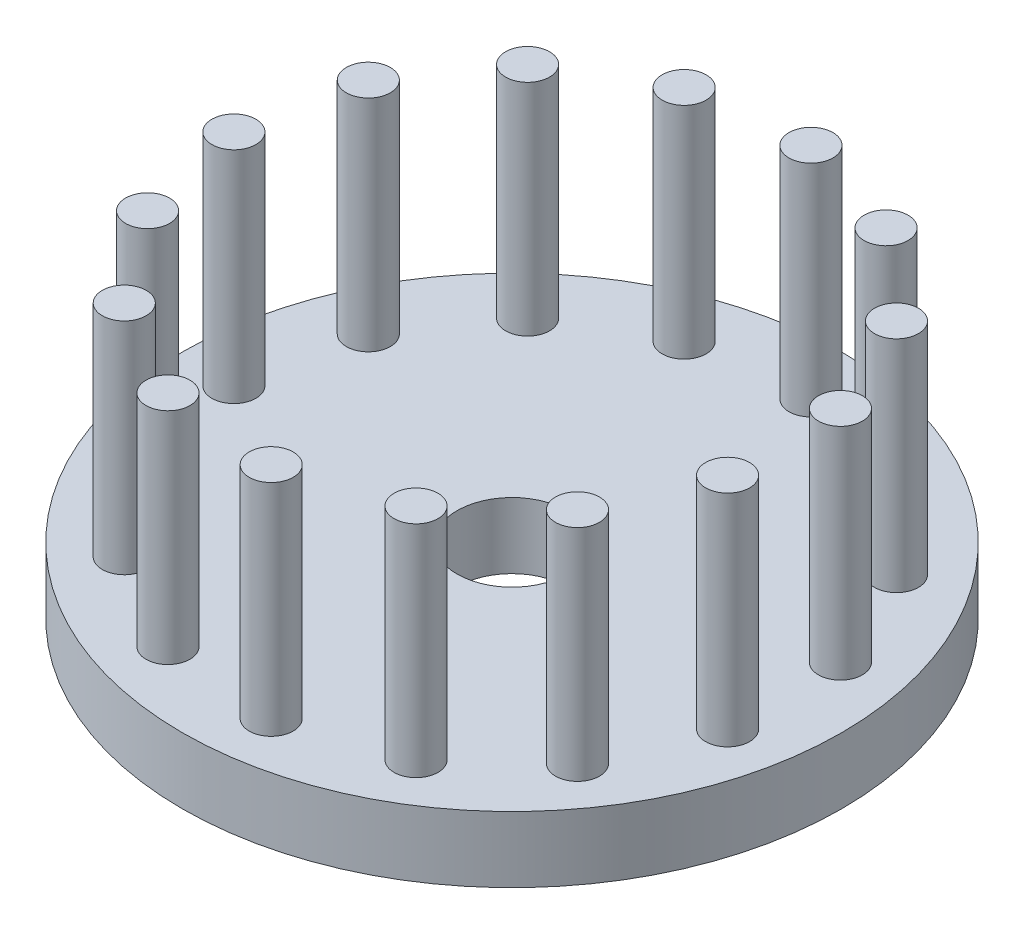
ISO-10303-21;
HEADER;
FILE_DESCRIPTION(('STEP AP214'),'2;1');
FILE_NAME('part.step','',(''),(''),'','','');
FILE_SCHEMA(('AUTOMOTIVE_DESIGN { 1 0 10303 214 1 1 1 1 }'));
ENDSEC;
DATA;
#1=APPLICATION_CONTEXT('core data for automotive mechanical design processes');
#2=APPLICATION_PROTOCOL_DEFINITION('international standard','automotive_design',2000,#1);
#3=PRODUCT_CONTEXT('',#1,'mechanical');
#4=PRODUCT('Part','Part','',(#3));
#5=PRODUCT_RELATED_PRODUCT_CATEGORY('part','',(#4));
#6=PRODUCT_DEFINITION_FORMATION('','',#4);
#7=PRODUCT_DEFINITION_CONTEXT('part definition',#1,'design');
#8=PRODUCT_DEFINITION('design','',#6,#7);
#9=PRODUCT_DEFINITION_SHAPE('','',#8);
#10=(LENGTH_UNIT() NAMED_UNIT(*) SI_UNIT(.MILLI.,.METRE.));
#11=(NAMED_UNIT(*) PLANE_ANGLE_UNIT() SI_UNIT($,.RADIAN.));
#12=(NAMED_UNIT(*) SI_UNIT($,.STERADIAN.) SOLID_ANGLE_UNIT());
#13=UNCERTAINTY_MEASURE_WITH_UNIT(LENGTH_MEASURE(1.E-05),#10,'distance_accuracy_value','');
#14=(GEOMETRIC_REPRESENTATION_CONTEXT(3) GLOBAL_UNCERTAINTY_ASSIGNED_CONTEXT((#13)) GLOBAL_UNIT_ASSIGNED_CONTEXT((#10,
#11,#12)) REPRESENTATION_CONTEXT('',''));
#15=CARTESIAN_POINT('',(0.,0.,0.));
#16=DIRECTION('',(0.,0.,1.));
#17=DIRECTION('',(1.,0.,0.));
#18=AXIS2_PLACEMENT_3D('',#15,#16,#17);
#19=CARTESIAN_POINT('',(0.,3.,0.));
#20=DIRECTION('',(0.,1.,0.));
#21=DIRECTION('',(0.,0.,1.));
#22=AXIS2_PLACEMENT_3D('',#19,#20,#21);
#23=PLANE('',#22);
#24=CARTESIAN_POINT('',(10.0218802409109,3.,-7.47073734224669));
#25=DIRECTION('',(0.,1.,0.));
#26=DIRECTION('',(-0.406736643075789,0.,0.913545457642606));
#27=AXIS2_PLACEMENT_3D('',#24,#25,#26);
#28=CIRCLE('',#27,1.);
#29=CARTESIAN_POINT('',(9.61514359783514,3.,-6.55719188460408));
#30=VERTEX_POINT('',#29);
#31=EDGE_CURVE('E133',#30,#30,#28,.T.);
#32=ORIENTED_EDGE('',*,*,#31,.F.);
#33=EDGE_LOOP('',(#32));
#34=FACE_BOUND('',#33,.T.);
#35=CARTESIAN_POINT('',(12.1940657990088,3.,-2.74859223775461));
#36=DIRECTION('',(0.,1.,0.));
#37=DIRECTION('',(-0.743144825477386,0.,0.669130606358867));
#38=AXIS2_PLACEMENT_3D('',#35,#36,#37);
#39=CIRCLE('',#38,1.);
#40=CARTESIAN_POINT('',(11.4509209735314,3.,-2.07946163139574));
#41=VERTEX_POINT('',#40);
#42=EDGE_CURVE('E127',#41,#41,#39,.T.);
#43=ORIENTED_EDGE('',*,*,#42,.F.);
#44=EDGE_LOOP('',(#43));
#45=FACE_BOUND('',#44,.T.);
#46=CARTESIAN_POINT('',(12.257786600848,3.,2.44880943482183));
#47=DIRECTION('',(0.,1.,0.));
#48=DIRECTION('',(-0.95105651629515,0.,0.309016994374957));
#49=AXIS2_PLACEMENT_3D('',#46,#47,#48);
#50=CIRCLE('',#49,1.);
#51=CARTESIAN_POINT('',(11.3067300845528,3.,2.75782642919679));
#52=VERTEX_POINT('',#51);
#53=EDGE_CURVE('E121',#52,#52,#50,.T.);
#54=ORIENTED_EDGE('',*,*,#53,.F.);
#55=EDGE_LOOP('',(#54));
#56=FACE_BOUND('',#55,.T.);
#57=CARTESIAN_POINT('',(10.2020247409052,3.,7.22278970938226));
#58=DIRECTION('',(0.,1.,0.));
#59=DIRECTION('',(-0.994521895368274,0.,-0.104528463267644));
#60=AXIS2_PLACEMENT_3D('',#57,#58,#59);
#61=CIRCLE('',#60,1.);
#62=CARTESIAN_POINT('',(9.20750284553693,3.,7.11826124611461));
#63=VERTEX_POINT('',#62);
#64=EDGE_CURVE('E115',#63,#63,#61,.T.);
#65=ORIENTED_EDGE('',*,*,#64,.F.);
#66=EDGE_LOOP('',(#65));
#67=FACE_BOUND('',#66,.T.);
#68=CARTESIAN_POINT('',(6.3822401207748,3.,10.7478840262059));
#69=DIRECTION('',(0.,1.,0.));
#70=DIRECTION('',(-0.866025403784443,0.,-0.499999999999992));
#71=AXIS2_PLACEMENT_3D('',#68,#69,#70);
#72=CIRCLE('',#71,1.);
#73=CARTESIAN_POINT('',(5.51621471699035,3.,10.2478840262059));
#74=VERTEX_POINT('',#73);
#75=EDGE_CURVE('E109',#74,#74,#72,.T.);
#76=ORIENTED_EDGE('',*,*,#75,.F.);
#77=EDGE_LOOP('',(#76));
#78=FACE_BOUND('',#77,.T.);
#79=CARTESIAN_POINT('',(1.45890820293115,3.,12.4145715534375));
#80=DIRECTION('',(0.,1.,0.));
#81=DIRECTION('',(-0.58778525229248,0.,-0.809016994374943));
#82=AXIS2_PLACEMENT_3D('',#79,#80,#81);
#83=CIRCLE('',#82,1.);
#84=CARTESIAN_POINT('',(0.871122950638671,3.,11.6055545590626));
#85=VERTEX_POINT('',#84);
#86=EDGE_CURVE('E103',#85,#85,#83,.T.);
#87=ORIENTED_EDGE('',*,*,#86,.F.);
#88=EDGE_LOOP('',(#87));
#89=FACE_BOUND('',#88,.T.);
#90=CARTESIAN_POINT('',(-3.71668219696423,3.,11.9346668762379));
#91=DIRECTION('',(0.,1.,0.));
#92=DIRECTION('',(-0.207911690817766,0.,-0.978147600733804));
#93=AXIS2_PLACEMENT_3D('',#90,#91,#92);
#94=CIRCLE('',#93,1.);
#95=CARTESIAN_POINT('',(-3.924593887782,3.,10.9565192755041));
#96=VERTEX_POINT('',#95);
#97=EDGE_CURVE('E97',#96,#96,#94,.T.);
#98=ORIENTED_EDGE('',*,*,#97,.F.);
#99=EDGE_LOOP('',(#98));
#100=FACE_BOUND('',#99,.T.);
#101=CARTESIAN_POINT('',(-8.24962448000674,3.,9.39114987309188));
#102=DIRECTION('',(0.,1.,0.));
#103=DIRECTION('',(0.207911690817753,0.,-0.978147600733807));
#104=AXIS2_PLACEMENT_3D('',#101,#102,#103);
#105=CIRCLE('',#104,1.);
#106=CARTESIAN_POINT('',(-8.04171278918899,3.,8.41300227235807));
#107=VERTEX_POINT('',#106);
#108=EDGE_CURVE('E91',#107,#107,#105,.T.);
#109=ORIENTED_EDGE('',*,*,#108,.F.);
#110=EDGE_LOOP('',(#109));
#111=FACE_BOUND('',#110,.T.);
#112=CARTESIAN_POINT('',(-11.3561317449705,3.,5.22381774097008));
#113=DIRECTION('',(0.,1.,0.));
#114=DIRECTION('',(0.587785252292469,0.,-0.80901699437495));
#115=AXIS2_PLACEMENT_3D('',#112,#113,#114);
#116=CIRCLE('',#115,1.);
#117=CARTESIAN_POINT('',(-10.768346492678,3.,4.41480074659512));
#118=VERTEX_POINT('',#117);
#119=EDGE_CURVE('E85',#118,#118,#116,.T.);
#120=ORIENTED_EDGE('',*,*,#119,.F.);
#121=EDGE_LOOP('',(#120));
#122=FACE_BOUND('',#121,.T.);
#123=CARTESIAN_POINT('',(-12.4990606640107,3.,0.153240064540216));
#124=DIRECTION('',(0.,1.,0.));
#125=DIRECTION('',(0.866025403784436,0.,-0.500000000000004));
#126=AXIS2_PLACEMENT_3D('',#123,#124,#125);
#127=CIRCLE('',#126,1.);
#128=CARTESIAN_POINT('',(-11.6330352602263,3.,-0.346759935459788));
#129=VERTEX_POINT('',#128);
#130=EDGE_CURVE('E79',#129,#129,#127,.T.);
#131=ORIENTED_EDGE('',*,*,#130,.F.);
#132=EDGE_LOOP('',(#131));
#133=FACE_BOUND('',#132,.T.);
#134=CARTESIAN_POINT('',(-11.4807884438421,3.,-4.94383421119094));
#135=DIRECTION('',(0.,1.,0.));
#136=DIRECTION('',(0.994521895368273,0.,-0.104528463267657));
#137=AXIS2_PLACEMENT_3D('',#134,#135,#136);
#138=CIRCLE('',#137,1.);
#139=CARTESIAN_POINT('',(-10.4862665484738,3.,-5.04836267445859));
#140=VERTEX_POINT('',#139);
#141=EDGE_CURVE('E73',#140,#140,#138,.T.);
#142=ORIENTED_EDGE('',*,*,#141,.F.);
#143=EDGE_LOOP('',(#142));
#144=FACE_BOUND('',#143,.T.);
#145=CARTESIAN_POINT('',(-8.4773836020445,3.,-9.18607463848335));
#146=DIRECTION('',(0.,1.,0.));
#147=DIRECTION('',(0.951056516295154,0.,0.309016994374945));
#148=AXIS2_PLACEMENT_3D('',#145,#146,#147);
#149=CIRCLE('',#148,1.);
#150=CARTESIAN_POINT('',(-7.52632708574935,3.,-8.87705764410841));
#151=VERTEX_POINT('',#150);
#152=EDGE_CURVE('E67',#151,#151,#149,.T.);
#153=ORIENTED_EDGE('',*,*,#152,.F.);
#154=EDGE_LOOP('',(#153));
#155=FACE_BOUND('',#154,.T.);
#156=CARTESIAN_POINT('',(-4.00816212084115,3.,-11.8399593079138));
#157=DIRECTION('',(0.,1.,0.));
#158=DIRECTION('',(0.743144825477395,0.,0.669130606358857));
#159=AXIS2_PLACEMENT_3D('',#156,#157,#158);
#160=CIRCLE('',#159,1.);
#161=CARTESIAN_POINT('',(-3.26501729536376,3.,-11.1708287015549));
#162=VERTEX_POINT('',#161);
#163=EDGE_CURVE('E61',#162,#162,#160,.T.);
#164=ORIENTED_EDGE('',*,*,#163,.F.);
#165=EDGE_LOOP('',(#164));
#166=FACE_BOUND('',#165,.T.);
#167=CARTESIAN_POINT('',(1.15410700406537,3.,-12.4466074503524));
#168=DIRECTION('',(0.,1.,0.));
#169=DIRECTION('',(0.406736643075801,0.,0.913545457642601));
#170=AXIS2_PLACEMENT_3D('',#167,#168,#169);
#171=CIRCLE('',#170,1.);
#172=CARTESIAN_POINT('',(1.56084364714117,3.,-11.5330619927098));
#173=VERTEX_POINT('',#172);
#174=EDGE_CURVE('E55',#173,#173,#171,.T.);
#175=ORIENTED_EDGE('',*,*,#174,.F.);
#176=EDGE_LOOP('',(#175));
#177=FACE_BOUND('',#176,.T.);
#178=CARTESIAN_POINT('',(6.11682054323601,3.,-10.9011240907461));
#179=DIRECTION('',(0.,1.,0.));
#180=DIRECTION('',(0.,0.,1.));
#181=AXIS2_PLACEMENT_3D('',#178,#179,#180);
#182=CIRCLE('',#181,1.);
#183=CARTESIAN_POINT('',(6.11682054323601,3.,-9.90112409074614));
#184=VERTEX_POINT('',#183);
#185=EDGE_CURVE('E49',#184,#184,#182,.T.);
#186=ORIENTED_EDGE('',*,*,#185,.F.);
#187=EDGE_LOOP('',(#186));
#188=FACE_BOUND('',#187,.T.);
#189=CARTESIAN_POINT('',(0.,3.,0.));
#190=DIRECTION('',(0.,1.,0.));
#191=DIRECTION('',(0.,0.,1.));
#192=AXIS2_PLACEMENT_3D('',#189,#190,#191);
#193=CIRCLE('',#192,15.);
#194=CARTESIAN_POINT('',(0.,3.,15.));
#195=VERTEX_POINT('',#194);
#196=EDGE_CURVE('E10',#195,#195,#193,.T.);
#197=ORIENTED_EDGE('',*,*,#196,.T.);
#198=EDGE_LOOP('',(#197));
#199=FACE_BOUND('',#198,.T.);
#200=CARTESIAN_POINT('',(0.,3.,0.));
#201=DIRECTION('',(0.,1.,0.));
#202=DIRECTION('',(0.,0.,1.));
#203=AXIS2_PLACEMENT_3D('',#200,#201,#202);
#204=CIRCLE('',#203,2.5);
#205=CARTESIAN_POINT('',(0.,3.,2.5));
#206=VERTEX_POINT('',#205);
#207=EDGE_CURVE('E41',#206,#206,#204,.T.);
#208=ORIENTED_EDGE('',*,*,#207,.F.);
#209=EDGE_LOOP('',(#208));
#210=FACE_BOUND('',#209,.T.);
#211=ADVANCED_FACE('F30',(#34,#45,#56,#67,#78,#89,#100,#111,#122,#133,#144,#155,#166,#177,#188,
#199,#210),#23,.T.);
#212=CARTESIAN_POINT('',(0.,0.,0.));
#213=DIRECTION('',(0.,1.,0.));
#214=DIRECTION('',(0.,0.,1.));
#215=AXIS2_PLACEMENT_3D('',#212,#213,#214);
#216=PLANE('',#215);
#217=CARTESIAN_POINT('',(0.,0.,0.));
#218=DIRECTION('',(0.,1.,0.));
#219=DIRECTION('',(0.,0.,1.));
#220=AXIS2_PLACEMENT_3D('',#217,#218,#219);
#221=CIRCLE('',#220,15.);
#222=CARTESIAN_POINT('',(0.,0.,15.));
#223=VERTEX_POINT('',#222);
#224=EDGE_CURVE('E34',#223,#223,#221,.T.);
#225=ORIENTED_EDGE('',*,*,#224,.F.);
#226=EDGE_LOOP('',(#225));
#227=FACE_BOUND('',#226,.T.);
#228=CARTESIAN_POINT('',(0.,0.,0.));
#229=DIRECTION('',(0.,1.,0.));
#230=DIRECTION('',(0.,0.,1.));
#231=AXIS2_PLACEMENT_3D('',#228,#229,#230);
#232=CIRCLE('',#231,2.5);
#233=CARTESIAN_POINT('',(0.,0.,2.5));
#234=VERTEX_POINT('',#233);
#235=EDGE_CURVE('E43',#234,#234,#232,.T.);
#236=ORIENTED_EDGE('',*,*,#235,.T.);
#237=EDGE_LOOP('',(#236));
#238=FACE_BOUND('',#237,.T.);
#239=ADVANCED_FACE('F150',(#227,#238),#216,.F.);
#240=CARTESIAN_POINT('',(0.,3.,0.));
#241=DIRECTION('',(0.,-1.,0.));
#242=DIRECTION('',(0.,0.,-1.));
#243=AXIS2_PLACEMENT_3D('',#240,#241,#242);
#244=CYLINDRICAL_SURFACE('',#243,15.);
#245=ORIENTED_EDGE('',*,*,#196,.F.);
#246=EDGE_LOOP('',(#245));
#247=FACE_BOUND('',#246,.T.);
#248=ORIENTED_EDGE('',*,*,#224,.T.);
#249=EDGE_LOOP('',(#248));
#250=FACE_BOUND('',#249,.T.);
#251=ADVANCED_FACE('F32',(#247,#250),#244,.T.);
#252=CARTESIAN_POINT('',(0.,3.,0.));
#253=DIRECTION('',(0.,-1.,0.));
#254=DIRECTION('',(0.,0.,-1.));
#255=AXIS2_PLACEMENT_3D('',#252,#253,#254);
#256=CYLINDRICAL_SURFACE('',#255,2.5);
#257=ORIENTED_EDGE('',*,*,#207,.T.);
#258=EDGE_LOOP('',(#257));
#259=FACE_BOUND('',#258,.T.);
#260=ORIENTED_EDGE('',*,*,#235,.F.);
#261=EDGE_LOOP('',(#260));
#262=FACE_BOUND('',#261,.T.);
#263=ADVANCED_FACE('F182',(#259,#262),#256,.F.);
#264=CARTESIAN_POINT('',(6.11682054323601,13.,-10.9011240907461));
#265=DIRECTION('',(0.,-1.,0.));
#266=DIRECTION('',(0.,0.,-1.));
#267=AXIS2_PLACEMENT_3D('',#264,#265,#266);
#268=CYLINDRICAL_SURFACE('',#267,1.);
#269=CARTESIAN_POINT('',(6.11682054323601,13.,-10.9011240907461));
#270=DIRECTION('',(0.,1.,0.));
#271=DIRECTION('',(0.,0.,1.));
#272=AXIS2_PLACEMENT_3D('',#269,#270,#271);
#273=CIRCLE('',#272,1.);
#274=CARTESIAN_POINT('',(6.11682054323601,13.,-9.90112409074614));
#275=VERTEX_POINT('',#274);
#276=EDGE_CURVE('E46',#275,#275,#273,.T.);
#277=ORIENTED_EDGE('',*,*,#276,.F.);
#278=EDGE_LOOP('',(#277));
#279=FACE_BOUND('',#278,.T.);
#280=ORIENTED_EDGE('',*,*,#185,.T.);
#281=EDGE_LOOP('',(#280));
#282=FACE_BOUND('',#281,.T.);
#283=ADVANCED_FACE('F185',(#279,#282),#268,.T.);
#284=CARTESIAN_POINT('',(6.11682054323601,13.,-10.9011240907461));
#285=DIRECTION('',(0.,1.,0.));
#286=DIRECTION('',(0.,0.,1.));
#287=AXIS2_PLACEMENT_3D('',#284,#285,#286);
#288=PLANE('',#287);
#289=ORIENTED_EDGE('',*,*,#276,.T.);
#290=EDGE_LOOP('',(#289));
#291=FACE_BOUND('',#290,.T.);
#292=ADVANCED_FACE('F199',(#291),#288,.T.);
#293=CARTESIAN_POINT('',(1.15410700406537,13.,-12.4466074503524));
#294=DIRECTION('',(0.,-1.,0.));
#295=DIRECTION('',(0.,0.,-1.));
#296=AXIS2_PLACEMENT_3D('',#293,#294,#295);
#297=CYLINDRICAL_SURFACE('',#296,1.);
#298=CARTESIAN_POINT('',(1.15410700406537,13.,-12.4466074503524));
#299=DIRECTION('',(0.,1.,0.));
#300=DIRECTION('',(0.406736643075801,0.,0.913545457642601));
#301=AXIS2_PLACEMENT_3D('',#298,#299,#300);
#302=CIRCLE('',#301,1.);
#303=CARTESIAN_POINT('',(1.56084364714117,13.,-11.5330619927098));
#304=VERTEX_POINT('',#303);
#305=EDGE_CURVE('E52',#304,#304,#302,.T.);
#306=ORIENTED_EDGE('',*,*,#305,.F.);
#307=EDGE_LOOP('',(#306));
#308=FACE_BOUND('',#307,.T.);
#309=ORIENTED_EDGE('',*,*,#174,.T.);
#310=EDGE_LOOP('',(#309));
#311=FACE_BOUND('',#310,.T.);
#312=ADVANCED_FACE('F203',(#308,#311),#297,.T.);
#313=CARTESIAN_POINT('',(1.15410700406537,13.,-12.4466074503524));
#314=DIRECTION('',(0.,1.,0.));
#315=DIRECTION('',(0.406736643075801,0.,0.913545457642601));
#316=AXIS2_PLACEMENT_3D('',#313,#314,#315);
#317=PLANE('',#316);
#318=ORIENTED_EDGE('',*,*,#305,.T.);
#319=EDGE_LOOP('',(#318));
#320=FACE_BOUND('',#319,.T.);
#321=ADVANCED_FACE('F207',(#320),#317,.T.);
#322=CARTESIAN_POINT('',(-4.00816212084115,13.,-11.8399593079138));
#323=DIRECTION('',(0.,-1.,0.));
#324=DIRECTION('',(0.,0.,-1.));
#325=AXIS2_PLACEMENT_3D('',#322,#323,#324);
#326=CYLINDRICAL_SURFACE('',#325,1.);
#327=CARTESIAN_POINT('',(-4.00816212084115,13.,-11.8399593079138));
#328=DIRECTION('',(0.,1.,0.));
#329=DIRECTION('',(0.743144825477395,0.,0.669130606358857));
#330=AXIS2_PLACEMENT_3D('',#327,#328,#329);
#331=CIRCLE('',#330,1.);
#332=CARTESIAN_POINT('',(-3.26501729536376,13.,-11.1708287015549));
#333=VERTEX_POINT('',#332);
#334=EDGE_CURVE('E58',#333,#333,#331,.T.);
#335=ORIENTED_EDGE('',*,*,#334,.F.);
#336=EDGE_LOOP('',(#335));
#337=FACE_BOUND('',#336,.T.);
#338=ORIENTED_EDGE('',*,*,#163,.T.);
#339=EDGE_LOOP('',(#338));
#340=FACE_BOUND('',#339,.T.);
#341=ADVANCED_FACE('F211',(#337,#340),#326,.T.);
#342=CARTESIAN_POINT('',(-4.00816212084115,13.,-11.8399593079138));
#343=DIRECTION('',(0.,1.,0.));
#344=DIRECTION('',(0.743144825477395,0.,0.669130606358857));
#345=AXIS2_PLACEMENT_3D('',#342,#343,#344);
#346=PLANE('',#345);
#347=ORIENTED_EDGE('',*,*,#334,.T.);
#348=EDGE_LOOP('',(#347));
#349=FACE_BOUND('',#348,.T.);
#350=ADVANCED_FACE('F215',(#349),#346,.T.);
#351=CARTESIAN_POINT('',(-8.4773836020445,13.,-9.18607463848335));
#352=DIRECTION('',(0.,-1.,0.));
#353=DIRECTION('',(0.,0.,-1.));
#354=AXIS2_PLACEMENT_3D('',#351,#352,#353);
#355=CYLINDRICAL_SURFACE('',#354,1.);
#356=CARTESIAN_POINT('',(-8.4773836020445,13.,-9.18607463848335));
#357=DIRECTION('',(0.,1.,0.));
#358=DIRECTION('',(0.951056516295154,0.,0.309016994374945));
#359=AXIS2_PLACEMENT_3D('',#356,#357,#358);
#360=CIRCLE('',#359,1.);
#361=CARTESIAN_POINT('',(-7.52632708574935,13.,-8.87705764410841));
#362=VERTEX_POINT('',#361);
#363=EDGE_CURVE('E64',#362,#362,#360,.T.);
#364=ORIENTED_EDGE('',*,*,#363,.F.);
#365=EDGE_LOOP('',(#364));
#366=FACE_BOUND('',#365,.T.);
#367=ORIENTED_EDGE('',*,*,#152,.T.);
#368=EDGE_LOOP('',(#367));
#369=FACE_BOUND('',#368,.T.);
#370=ADVANCED_FACE('F219',(#366,#369),#355,.T.);
#371=CARTESIAN_POINT('',(-8.4773836020445,13.,-9.18607463848335));
#372=DIRECTION('',(0.,1.,0.));
#373=DIRECTION('',(0.951056516295154,0.,0.309016994374945));
#374=AXIS2_PLACEMENT_3D('',#371,#372,#373);
#375=PLANE('',#374);
#376=ORIENTED_EDGE('',*,*,#363,.T.);
#377=EDGE_LOOP('',(#376));
#378=FACE_BOUND('',#377,.T.);
#379=ADVANCED_FACE('F223',(#378),#375,.T.);
#380=CARTESIAN_POINT('',(-11.4807884438421,13.,-4.94383421119094));
#381=DIRECTION('',(0.,-1.,0.));
#382=DIRECTION('',(0.,0.,-1.));
#383=AXIS2_PLACEMENT_3D('',#380,#381,#382);
#384=CYLINDRICAL_SURFACE('',#383,1.);
#385=CARTESIAN_POINT('',(-11.4807884438421,13.,-4.94383421119094));
#386=DIRECTION('',(0.,1.,0.));
#387=DIRECTION('',(0.994521895368273,0.,-0.104528463267657));
#388=AXIS2_PLACEMENT_3D('',#385,#386,#387);
#389=CIRCLE('',#388,1.);
#390=CARTESIAN_POINT('',(-10.4862665484738,13.,-5.04836267445859));
#391=VERTEX_POINT('',#390);
#392=EDGE_CURVE('E70',#391,#391,#389,.T.);
#393=ORIENTED_EDGE('',*,*,#392,.F.);
#394=EDGE_LOOP('',(#393));
#395=FACE_BOUND('',#394,.T.);
#396=ORIENTED_EDGE('',*,*,#141,.T.);
#397=EDGE_LOOP('',(#396));
#398=FACE_BOUND('',#397,.T.);
#399=ADVANCED_FACE('F227',(#395,#398),#384,.T.);
#400=CARTESIAN_POINT('',(-11.4807884438421,13.,-4.94383421119094));
#401=DIRECTION('',(0.,1.,0.));
#402=DIRECTION('',(0.994521895368273,0.,-0.104528463267657));
#403=AXIS2_PLACEMENT_3D('',#400,#401,#402);
#404=PLANE('',#403);
#405=ORIENTED_EDGE('',*,*,#392,.T.);
#406=EDGE_LOOP('',(#405));
#407=FACE_BOUND('',#406,.T.);
#408=ADVANCED_FACE('F231',(#407),#404,.T.);
#409=CARTESIAN_POINT('',(-12.4990606640107,13.,0.153240064540216));
#410=DIRECTION('',(0.,-1.,0.));
#411=DIRECTION('',(0.,0.,-1.));
#412=AXIS2_PLACEMENT_3D('',#409,#410,#411);
#413=CYLINDRICAL_SURFACE('',#412,1.);
#414=CARTESIAN_POINT('',(-12.4990606640107,13.,0.153240064540216));
#415=DIRECTION('',(0.,1.,0.));
#416=DIRECTION('',(0.866025403784436,0.,-0.500000000000004));
#417=AXIS2_PLACEMENT_3D('',#414,#415,#416);
#418=CIRCLE('',#417,1.);
#419=CARTESIAN_POINT('',(-11.6330352602263,13.,-0.346759935459788));
#420=VERTEX_POINT('',#419);
#421=EDGE_CURVE('E76',#420,#420,#418,.T.);
#422=ORIENTED_EDGE('',*,*,#421,.F.);
#423=EDGE_LOOP('',(#422));
#424=FACE_BOUND('',#423,.T.);
#425=ORIENTED_EDGE('',*,*,#130,.T.);
#426=EDGE_LOOP('',(#425));
#427=FACE_BOUND('',#426,.T.);
#428=ADVANCED_FACE('F235',(#424,#427),#413,.T.);
#429=CARTESIAN_POINT('',(-12.4990606640107,13.,0.153240064540216));
#430=DIRECTION('',(0.,1.,0.));
#431=DIRECTION('',(0.866025403784436,0.,-0.500000000000004));
#432=AXIS2_PLACEMENT_3D('',#429,#430,#431);
#433=PLANE('',#432);
#434=ORIENTED_EDGE('',*,*,#421,.T.);
#435=EDGE_LOOP('',(#434));
#436=FACE_BOUND('',#435,.T.);
#437=ADVANCED_FACE('F239',(#436),#433,.T.);
#438=CARTESIAN_POINT('',(-11.3561317449705,13.,5.22381774097008));
#439=DIRECTION('',(0.,-1.,0.));
#440=DIRECTION('',(0.,0.,-1.));
#441=AXIS2_PLACEMENT_3D('',#438,#439,#440);
#442=CYLINDRICAL_SURFACE('',#441,1.);
#443=CARTESIAN_POINT('',(-11.3561317449705,13.,5.22381774097008));
#444=DIRECTION('',(0.,1.,0.));
#445=DIRECTION('',(0.587785252292469,0.,-0.80901699437495));
#446=AXIS2_PLACEMENT_3D('',#443,#444,#445);
#447=CIRCLE('',#446,1.);
#448=CARTESIAN_POINT('',(-10.768346492678,13.,4.41480074659512));
#449=VERTEX_POINT('',#448);
#450=EDGE_CURVE('E82',#449,#449,#447,.T.);
#451=ORIENTED_EDGE('',*,*,#450,.F.);
#452=EDGE_LOOP('',(#451));
#453=FACE_BOUND('',#452,.T.);
#454=ORIENTED_EDGE('',*,*,#119,.T.);
#455=EDGE_LOOP('',(#454));
#456=FACE_BOUND('',#455,.T.);
#457=ADVANCED_FACE('F243',(#453,#456),#442,.T.);
#458=CARTESIAN_POINT('',(-11.3561317449705,13.,5.22381774097008));
#459=DIRECTION('',(0.,1.,0.));
#460=DIRECTION('',(0.587785252292469,0.,-0.80901699437495));
#461=AXIS2_PLACEMENT_3D('',#458,#459,#460);
#462=PLANE('',#461);
#463=ORIENTED_EDGE('',*,*,#450,.T.);
#464=EDGE_LOOP('',(#463));
#465=FACE_BOUND('',#464,.T.);
#466=ADVANCED_FACE('F247',(#465),#462,.T.);
#467=CARTESIAN_POINT('',(-8.24962448000674,13.,9.39114987309188));
#468=DIRECTION('',(0.,-1.,0.));
#469=DIRECTION('',(0.,0.,-1.));
#470=AXIS2_PLACEMENT_3D('',#467,#468,#469);
#471=CYLINDRICAL_SURFACE('',#470,1.);
#472=CARTESIAN_POINT('',(-8.24962448000674,13.,9.39114987309188));
#473=DIRECTION('',(0.,1.,0.));
#474=DIRECTION('',(0.207911690817753,0.,-0.978147600733807));
#475=AXIS2_PLACEMENT_3D('',#472,#473,#474);
#476=CIRCLE('',#475,1.);
#477=CARTESIAN_POINT('',(-8.04171278918899,13.,8.41300227235807));
#478=VERTEX_POINT('',#477);
#479=EDGE_CURVE('E88',#478,#478,#476,.T.);
#480=ORIENTED_EDGE('',*,*,#479,.F.);
#481=EDGE_LOOP('',(#480));
#482=FACE_BOUND('',#481,.T.);
#483=ORIENTED_EDGE('',*,*,#108,.T.);
#484=EDGE_LOOP('',(#483));
#485=FACE_BOUND('',#484,.T.);
#486=ADVANCED_FACE('F251',(#482,#485),#471,.T.);
#487=CARTESIAN_POINT('',(-8.24962448000674,13.,9.39114987309188));
#488=DIRECTION('',(0.,1.,0.));
#489=DIRECTION('',(0.207911690817753,0.,-0.978147600733807));
#490=AXIS2_PLACEMENT_3D('',#487,#488,#489);
#491=PLANE('',#490);
#492=ORIENTED_EDGE('',*,*,#479,.T.);
#493=EDGE_LOOP('',(#492));
#494=FACE_BOUND('',#493,.T.);
#495=ADVANCED_FACE('F255',(#494),#491,.T.);
#496=CARTESIAN_POINT('',(-3.71668219696423,13.,11.9346668762379));
#497=DIRECTION('',(0.,-1.,0.));
#498=DIRECTION('',(0.,0.,-1.));
#499=AXIS2_PLACEMENT_3D('',#496,#497,#498);
#500=CYLINDRICAL_SURFACE('',#499,1.);
#501=CARTESIAN_POINT('',(-3.71668219696423,13.,11.9346668762379));
#502=DIRECTION('',(0.,1.,0.));
#503=DIRECTION('',(-0.207911690817766,0.,-0.978147600733804));
#504=AXIS2_PLACEMENT_3D('',#501,#502,#503);
#505=CIRCLE('',#504,1.);
#506=CARTESIAN_POINT('',(-3.924593887782,13.,10.9565192755041));
#507=VERTEX_POINT('',#506);
#508=EDGE_CURVE('E94',#507,#507,#505,.T.);
#509=ORIENTED_EDGE('',*,*,#508,.F.);
#510=EDGE_LOOP('',(#509));
#511=FACE_BOUND('',#510,.T.);
#512=ORIENTED_EDGE('',*,*,#97,.T.);
#513=EDGE_LOOP('',(#512));
#514=FACE_BOUND('',#513,.T.);
#515=ADVANCED_FACE('F259',(#511,#514),#500,.T.);
#516=CARTESIAN_POINT('',(-3.71668219696423,13.,11.9346668762379));
#517=DIRECTION('',(0.,1.,0.));
#518=DIRECTION('',(-0.207911690817766,0.,-0.978147600733804));
#519=AXIS2_PLACEMENT_3D('',#516,#517,#518);
#520=PLANE('',#519);
#521=ORIENTED_EDGE('',*,*,#508,.T.);
#522=EDGE_LOOP('',(#521));
#523=FACE_BOUND('',#522,.T.);
#524=ADVANCED_FACE('F263',(#523),#520,.T.);
#525=CARTESIAN_POINT('',(1.45890820293115,13.,12.4145715534375));
#526=DIRECTION('',(0.,-1.,0.));
#527=DIRECTION('',(0.,0.,-1.));
#528=AXIS2_PLACEMENT_3D('',#525,#526,#527);
#529=CYLINDRICAL_SURFACE('',#528,1.);
#530=CARTESIAN_POINT('',(1.45890820293115,13.,12.4145715534375));
#531=DIRECTION('',(0.,1.,0.));
#532=DIRECTION('',(-0.58778525229248,0.,-0.809016994374943));
#533=AXIS2_PLACEMENT_3D('',#530,#531,#532);
#534=CIRCLE('',#533,1.);
#535=CARTESIAN_POINT('',(0.871122950638671,13.,11.6055545590626));
#536=VERTEX_POINT('',#535);
#537=EDGE_CURVE('E100',#536,#536,#534,.T.);
#538=ORIENTED_EDGE('',*,*,#537,.F.);
#539=EDGE_LOOP('',(#538));
#540=FACE_BOUND('',#539,.T.);
#541=ORIENTED_EDGE('',*,*,#86,.T.);
#542=EDGE_LOOP('',(#541));
#543=FACE_BOUND('',#542,.T.);
#544=ADVANCED_FACE('F267',(#540,#543),#529,.T.);
#545=CARTESIAN_POINT('',(1.45890820293115,13.,12.4145715534375));
#546=DIRECTION('',(0.,1.,0.));
#547=DIRECTION('',(-0.58778525229248,0.,-0.809016994374943));
#548=AXIS2_PLACEMENT_3D('',#545,#546,#547);
#549=PLANE('',#548);
#550=ORIENTED_EDGE('',*,*,#537,.T.);
#551=EDGE_LOOP('',(#550));
#552=FACE_BOUND('',#551,.T.);
#553=ADVANCED_FACE('F271',(#552),#549,.T.);
#554=CARTESIAN_POINT('',(6.3822401207748,13.,10.7478840262059));
#555=DIRECTION('',(0.,-1.,0.));
#556=DIRECTION('',(0.,0.,-1.));
#557=AXIS2_PLACEMENT_3D('',#554,#555,#556);
#558=CYLINDRICAL_SURFACE('',#557,1.);
#559=CARTESIAN_POINT('',(6.3822401207748,13.,10.7478840262059));
#560=DIRECTION('',(0.,1.,0.));
#561=DIRECTION('',(-0.866025403784443,0.,-0.499999999999992));
#562=AXIS2_PLACEMENT_3D('',#559,#560,#561);
#563=CIRCLE('',#562,1.);
#564=CARTESIAN_POINT('',(5.51621471699035,13.,10.2478840262059));
#565=VERTEX_POINT('',#564);
#566=EDGE_CURVE('E106',#565,#565,#563,.T.);
#567=ORIENTED_EDGE('',*,*,#566,.F.);
#568=EDGE_LOOP('',(#567));
#569=FACE_BOUND('',#568,.T.);
#570=ORIENTED_EDGE('',*,*,#75,.T.);
#571=EDGE_LOOP('',(#570));
#572=FACE_BOUND('',#571,.T.);
#573=ADVANCED_FACE('F275',(#569,#572),#558,.T.);
#574=CARTESIAN_POINT('',(6.3822401207748,13.,10.7478840262059));
#575=DIRECTION('',(0.,1.,0.));
#576=DIRECTION('',(-0.866025403784443,0.,-0.499999999999992));
#577=AXIS2_PLACEMENT_3D('',#574,#575,#576);
#578=PLANE('',#577);
#579=ORIENTED_EDGE('',*,*,#566,.T.);
#580=EDGE_LOOP('',(#579));
#581=FACE_BOUND('',#580,.T.);
#582=ADVANCED_FACE('F279',(#581),#578,.T.);
#583=CARTESIAN_POINT('',(10.2020247409052,13.,7.22278970938226));
#584=DIRECTION('',(0.,-1.,0.));
#585=DIRECTION('',(0.,0.,-1.));
#586=AXIS2_PLACEMENT_3D('',#583,#584,#585);
#587=CYLINDRICAL_SURFACE('',#586,1.);
#588=CARTESIAN_POINT('',(10.2020247409052,13.,7.22278970938226));
#589=DIRECTION('',(0.,1.,0.));
#590=DIRECTION('',(-0.994521895368274,0.,-0.104528463267644));
#591=AXIS2_PLACEMENT_3D('',#588,#589,#590);
#592=CIRCLE('',#591,1.);
#593=CARTESIAN_POINT('',(9.20750284553693,13.,7.11826124611461));
#594=VERTEX_POINT('',#593);
#595=EDGE_CURVE('E112',#594,#594,#592,.T.);
#596=ORIENTED_EDGE('',*,*,#595,.F.);
#597=EDGE_LOOP('',(#596));
#598=FACE_BOUND('',#597,.T.);
#599=ORIENTED_EDGE('',*,*,#64,.T.);
#600=EDGE_LOOP('',(#599));
#601=FACE_BOUND('',#600,.T.);
#602=ADVANCED_FACE('F283',(#598,#601),#587,.T.);
#603=CARTESIAN_POINT('',(10.2020247409052,13.,7.22278970938226));
#604=DIRECTION('',(0.,1.,0.));
#605=DIRECTION('',(-0.994521895368274,0.,-0.104528463267644));
#606=AXIS2_PLACEMENT_3D('',#603,#604,#605);
#607=PLANE('',#606);
#608=ORIENTED_EDGE('',*,*,#595,.T.);
#609=EDGE_LOOP('',(#608));
#610=FACE_BOUND('',#609,.T.);
#611=ADVANCED_FACE('F287',(#610),#607,.T.);
#612=CARTESIAN_POINT('',(12.257786600848,13.,2.44880943482183));
#613=DIRECTION('',(0.,-1.,0.));
#614=DIRECTION('',(0.,0.,-1.));
#615=AXIS2_PLACEMENT_3D('',#612,#613,#614);
#616=CYLINDRICAL_SURFACE('',#615,1.);
#617=CARTESIAN_POINT('',(12.257786600848,13.,2.44880943482183));
#618=DIRECTION('',(0.,1.,0.));
#619=DIRECTION('',(-0.95105651629515,0.,0.309016994374957));
#620=AXIS2_PLACEMENT_3D('',#617,#618,#619);
#621=CIRCLE('',#620,1.);
#622=CARTESIAN_POINT('',(11.3067300845528,13.,2.75782642919679));
#623=VERTEX_POINT('',#622);
#624=EDGE_CURVE('E118',#623,#623,#621,.T.);
#625=ORIENTED_EDGE('',*,*,#624,.F.);
#626=EDGE_LOOP('',(#625));
#627=FACE_BOUND('',#626,.T.);
#628=ORIENTED_EDGE('',*,*,#53,.T.);
#629=EDGE_LOOP('',(#628));
#630=FACE_BOUND('',#629,.T.);
#631=ADVANCED_FACE('F291',(#627,#630),#616,.T.);
#632=CARTESIAN_POINT('',(12.257786600848,13.,2.44880943482183));
#633=DIRECTION('',(0.,1.,0.));
#634=DIRECTION('',(-0.95105651629515,0.,0.309016994374957));
#635=AXIS2_PLACEMENT_3D('',#632,#633,#634);
#636=PLANE('',#635);
#637=ORIENTED_EDGE('',*,*,#624,.T.);
#638=EDGE_LOOP('',(#637));
#639=FACE_BOUND('',#638,.T.);
#640=ADVANCED_FACE('F295',(#639),#636,.T.);
#641=CARTESIAN_POINT('',(12.1940657990088,13.,-2.74859223775461));
#642=DIRECTION('',(0.,-1.,0.));
#643=DIRECTION('',(0.,0.,-1.));
#644=AXIS2_PLACEMENT_3D('',#641,#642,#643);
#645=CYLINDRICAL_SURFACE('',#644,1.);
#646=CARTESIAN_POINT('',(12.1940657990088,13.,-2.74859223775461));
#647=DIRECTION('',(0.,1.,0.));
#648=DIRECTION('',(-0.743144825477386,0.,0.669130606358867));
#649=AXIS2_PLACEMENT_3D('',#646,#647,#648);
#650=CIRCLE('',#649,1.);
#651=CARTESIAN_POINT('',(11.4509209735314,13.,-2.07946163139574));
#652=VERTEX_POINT('',#651);
#653=EDGE_CURVE('E124',#652,#652,#650,.T.);
#654=ORIENTED_EDGE('',*,*,#653,.F.);
#655=EDGE_LOOP('',(#654));
#656=FACE_BOUND('',#655,.T.);
#657=ORIENTED_EDGE('',*,*,#42,.T.);
#658=EDGE_LOOP('',(#657));
#659=FACE_BOUND('',#658,.T.);
#660=ADVANCED_FACE('F299',(#656,#659),#645,.T.);
#661=CARTESIAN_POINT('',(12.1940657990088,13.,-2.74859223775461));
#662=DIRECTION('',(0.,1.,0.));
#663=DIRECTION('',(-0.743144825477386,0.,0.669130606358867));
#664=AXIS2_PLACEMENT_3D('',#661,#662,#663);
#665=PLANE('',#664);
#666=ORIENTED_EDGE('',*,*,#653,.T.);
#667=EDGE_LOOP('',(#666));
#668=FACE_BOUND('',#667,.T.);
#669=ADVANCED_FACE('F144',(#668),#665,.T.);
#670=CARTESIAN_POINT('',(10.0218802409109,13.,-7.47073734224669));
#671=DIRECTION('',(0.,-1.,0.));
#672=DIRECTION('',(0.,0.,-1.));
#673=AXIS2_PLACEMENT_3D('',#670,#671,#672);
#674=CYLINDRICAL_SURFACE('',#673,1.);
#675=CARTESIAN_POINT('',(10.0218802409109,13.,-7.47073734224669));
#676=DIRECTION('',(0.,1.,0.));
#677=DIRECTION('',(-0.406736643075789,0.,0.913545457642606));
#678=AXIS2_PLACEMENT_3D('',#675,#676,#677);
#679=CIRCLE('',#678,1.);
#680=CARTESIAN_POINT('',(9.61514359783514,13.,-6.55719188460408));
#681=VERTEX_POINT('',#680);
#682=EDGE_CURVE('E130',#681,#681,#679,.T.);
#683=ORIENTED_EDGE('',*,*,#682,.F.);
#684=EDGE_LOOP('',(#683));
#685=FACE_BOUND('',#684,.T.);
#686=ORIENTED_EDGE('',*,*,#31,.T.);
#687=EDGE_LOOP('',(#686));
#688=FACE_BOUND('',#687,.T.);
#689=ADVANCED_FACE('F141',(#685,#688),#674,.T.);
#690=CARTESIAN_POINT('',(10.0218802409109,13.,-7.47073734224669));
#691=DIRECTION('',(0.,1.,0.));
#692=DIRECTION('',(-0.406736643075789,0.,0.913545457642606));
#693=AXIS2_PLACEMENT_3D('',#690,#691,#692);
#694=PLANE('',#693);
#695=ORIENTED_EDGE('',*,*,#682,.T.);
#696=EDGE_LOOP('',(#695));
#697=FACE_BOUND('',#696,.T.);
#698=ADVANCED_FACE('F139',(#697),#694,.T.);
#699=CLOSED_SHELL('',(#211,#239,#251,#263,#283,#292,#312,#321,#341,#350,#370,#379,#399,#408,
#428,#437,#457,#466,#486,#495,#515,#524,#544,#553,#573,#582,#602,#611,#631,#640,#660,#669,#689,#698));
#700=MANIFOLD_SOLID_BREP('B2',#699);
#701=ADVANCED_BREP_SHAPE_REPRESENTATION('',(#18,#700),#14);
#702=SHAPE_DEFINITION_REPRESENTATION(#9,#701);
ENDSEC;
END-ISO-10303-21;
